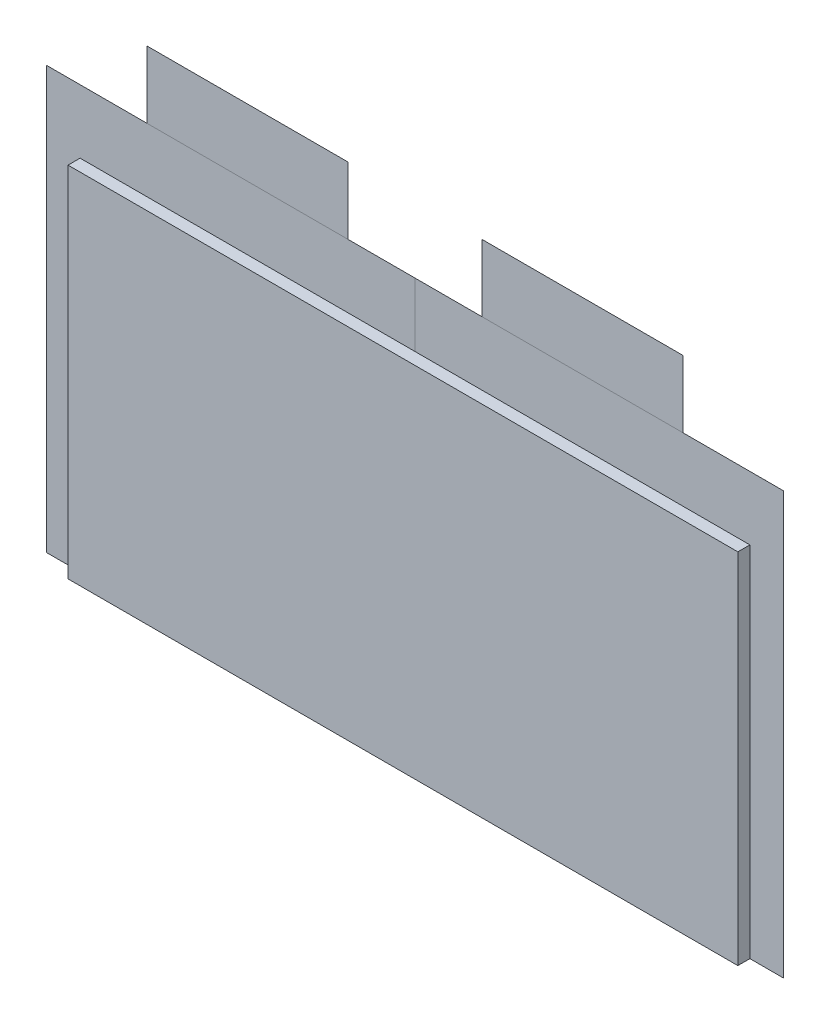
ISO-10303-21;
HEADER;
FILE_DESCRIPTION(('STEP AP214'),'2;1');
FILE_NAME('part.step','',(''),(''),'','','');
FILE_SCHEMA(('AUTOMOTIVE_DESIGN { 1 0 10303 214 1 1 1 1 }'));
ENDSEC;
DATA;
#1=APPLICATION_CONTEXT('core data for automotive mechanical design processes');
#2=APPLICATION_PROTOCOL_DEFINITION('international standard','automotive_design',2000,#1);
#3=PRODUCT_CONTEXT('',#1,'mechanical');
#4=PRODUCT('Part','Part','',(#3));
#5=PRODUCT_RELATED_PRODUCT_CATEGORY('part','',(#4));
#6=PRODUCT_DEFINITION_FORMATION('','',#4);
#7=PRODUCT_DEFINITION_CONTEXT('part definition',#1,'design');
#8=PRODUCT_DEFINITION('design','',#6,#7);
#9=PRODUCT_DEFINITION_SHAPE('','',#8);
#10=(LENGTH_UNIT() NAMED_UNIT(*) SI_UNIT(.MILLI.,.METRE.));
#11=(NAMED_UNIT(*) PLANE_ANGLE_UNIT() SI_UNIT($,.RADIAN.));
#12=(NAMED_UNIT(*) SI_UNIT($,.STERADIAN.) SOLID_ANGLE_UNIT());
#13=UNCERTAINTY_MEASURE_WITH_UNIT(LENGTH_MEASURE(1.E-05),#10,'distance_accuracy_value','');
#14=(GEOMETRIC_REPRESENTATION_CONTEXT(3) GLOBAL_UNCERTAINTY_ASSIGNED_CONTEXT((#13)) GLOBAL_UNIT_ASSIGNED_CONTEXT((#10,
#11,#12)) REPRESENTATION_CONTEXT('',''));
#15=CARTESIAN_POINT('',(0.,0.,0.));
#16=DIRECTION('',(0.,0.,1.));
#17=DIRECTION('',(1.,0.,0.));
#18=AXIS2_PLACEMENT_3D('',#15,#16,#17);
#19=CARTESIAN_POINT('',(0.,72.5,5.E-05));
#20=DIRECTION('',(0.,1.,0.));
#21=DIRECTION('',(-1.,0.,0.));
#22=AXIS2_PLACEMENT_3D('',#19,#20,#21);
#23=PLANE('',#22);
#24=DIRECTION('',(1.,0.,0.));
#25=VECTOR('',#24,1.);
#26=CARTESIAN_POINT('',(0.,72.5,-5.E-05));
#27=LINE('',#26,#25);
#28=CARTESIAN_POINT('',(20.,72.5,-5.E-05));
#29=VERTEX_POINT('',#28);
#30=CARTESIAN_POINT('',(80.,72.5,-5.E-05));
#31=VERTEX_POINT('',#30);
#32=EDGE_CURVE('E119',#29,#31,#27,.T.);
#33=ORIENTED_EDGE('',*,*,#32,.T.);
#34=DIRECTION('',(0.,0.,-1.));
#35=VECTOR('',#34,1.);
#36=CARTESIAN_POINT('',(80.,72.5,5.E-05));
#37=LINE('',#36,#35);
#38=CARTESIAN_POINT('',(80.,72.5,5.E-05));
#39=VERTEX_POINT('',#38);
#40=EDGE_CURVE('E12',#39,#31,#37,.T.);
#41=ORIENTED_EDGE('',*,*,#40,.F.);
#42=DIRECTION('',(1.,0.,0.));
#43=VECTOR('',#42,1.);
#44=CARTESIAN_POINT('',(0.,72.5,5.E-05));
#45=LINE('',#44,#43);
#46=CARTESIAN_POINT('',(20.,72.5,5.E-05));
#47=VERTEX_POINT('',#46);
#48=EDGE_CURVE('E107',#47,#39,#45,.T.);
#49=ORIENTED_EDGE('',*,*,#48,.F.);
#50=DIRECTION('',(0.,0.,-1.));
#51=VECTOR('',#50,1.);
#52=CARTESIAN_POINT('',(20.,72.5,5.E-05));
#53=LINE('',#52,#51);
#54=EDGE_CURVE('E115',#47,#29,#53,.T.);
#55=ORIENTED_EDGE('',*,*,#54,.T.);
#56=EDGE_LOOP('',(#33,#41,#49,#55));
#57=FACE_BOUND('',#56,.T.);
#58=ADVANCED_FACE('F56',(#57),#23,.F.);
#59=CARTESIAN_POINT('',(80.,0.,5.E-05));
#60=DIRECTION('',(-1.,0.,0.));
#61=DIRECTION('',(0.,0.,1.));
#62=AXIS2_PLACEMENT_3D('',#59,#60,#61);
#63=PLANE('',#62);
#64=DIRECTION('',(0.,1.,0.));
#65=VECTOR('',#64,1.);
#66=CARTESIAN_POINT('',(80.,0.,-5.E-05));
#67=LINE('',#66,#65);
#68=CARTESIAN_POINT('',(80.,92.5,-5.E-05));
#69=VERTEX_POINT('',#68);
#70=EDGE_CURVE('E111',#31,#69,#67,.T.);
#71=ORIENTED_EDGE('',*,*,#70,.T.);
#72=DIRECTION('',(0.,0.,-1.));
#73=VECTOR('',#72,1.);
#74=CARTESIAN_POINT('',(80.,92.5,5.E-05));
#75=LINE('',#74,#73);
#76=CARTESIAN_POINT('',(80.,92.5,5.E-05));
#77=VERTEX_POINT('',#76);
#78=EDGE_CURVE('E64',#77,#69,#75,.T.);
#79=ORIENTED_EDGE('',*,*,#78,.F.);
#80=DIRECTION('',(0.,1.,0.));
#81=VECTOR('',#80,1.);
#82=CARTESIAN_POINT('',(80.,0.,5.E-05));
#83=LINE('',#82,#81);
#84=EDGE_CURVE('E102',#39,#77,#83,.T.);
#85=ORIENTED_EDGE('',*,*,#84,.F.);
#86=ORIENTED_EDGE('',*,*,#40,.T.);
#87=EDGE_LOOP('',(#71,#79,#85,#86));
#88=FACE_BOUND('',#87,.T.);
#89=ADVANCED_FACE('F110',(#88),#63,.F.);
#90=CARTESIAN_POINT('',(0.,92.5,5.E-05));
#91=DIRECTION('',(0.,-1.,0.));
#92=DIRECTION('',(1.,0.,0.));
#93=AXIS2_PLACEMENT_3D('',#90,#91,#92);
#94=PLANE('',#93);
#95=DIRECTION('',(-1.,0.,0.));
#96=VECTOR('',#95,1.);
#97=CARTESIAN_POINT('',(0.,92.5,-5.E-05));
#98=LINE('',#97,#96);
#99=CARTESIAN_POINT('',(20.,92.5,-5.E-05));
#100=VERTEX_POINT('',#99);
#101=EDGE_CURVE('E89',#69,#100,#98,.T.);
#102=ORIENTED_EDGE('',*,*,#101,.T.);
#103=DIRECTION('',(0.,0.,-1.));
#104=VECTOR('',#103,1.);
#105=CARTESIAN_POINT('',(20.,92.5,5.E-05));
#106=LINE('',#105,#104);
#107=CARTESIAN_POINT('',(20.,92.5,5.E-05));
#108=VERTEX_POINT('',#107);
#109=EDGE_CURVE('E112',#108,#100,#106,.T.);
#110=ORIENTED_EDGE('',*,*,#109,.F.);
#111=DIRECTION('',(-1.,0.,0.));
#112=VECTOR('',#111,1.);
#113=CARTESIAN_POINT('',(0.,92.5,5.E-05));
#114=LINE('',#113,#112);
#115=EDGE_CURVE('E105',#77,#108,#114,.T.);
#116=ORIENTED_EDGE('',*,*,#115,.F.);
#117=ORIENTED_EDGE('',*,*,#78,.T.);
#118=EDGE_LOOP('',(#102,#110,#116,#117));
#119=FACE_BOUND('',#118,.T.);
#120=ADVANCED_FACE('F113',(#119),#94,.F.);
#121=CARTESIAN_POINT('',(20.0000000000001,0.,5.E-05));
#122=DIRECTION('',(1.,0.,0.));
#123=DIRECTION('',(0.,1.,0.));
#124=AXIS2_PLACEMENT_3D('',#121,#122,#123);
#125=PLANE('',#124);
#126=DIRECTION('',(0.,-1.,0.));
#127=VECTOR('',#126,1.);
#128=CARTESIAN_POINT('',(20.0000000000001,0.,-5.E-05));
#129=LINE('',#128,#127);
#130=EDGE_CURVE('E95',#100,#29,#129,.T.);
#131=ORIENTED_EDGE('',*,*,#130,.T.);
#132=ORIENTED_EDGE('',*,*,#54,.F.);
#133=DIRECTION('',(0.,-1.,0.));
#134=VECTOR('',#133,1.);
#135=CARTESIAN_POINT('',(20.0000000000001,0.,5.E-05));
#136=LINE('',#135,#134);
#137=EDGE_CURVE('E72',#108,#47,#136,.T.);
#138=ORIENTED_EDGE('',*,*,#137,.F.);
#139=ORIENTED_EDGE('',*,*,#109,.T.);
#140=EDGE_LOOP('',(#131,#132,#138,#139));
#141=FACE_BOUND('',#140,.T.);
#142=ADVANCED_FACE('F126',(#141),#125,.F.);
#143=CARTESIAN_POINT('',(0.,0.,5.E-05));
#144=DIRECTION('',(0.,0.,1.));
#145=DIRECTION('',(1.,0.,0.));
#146=AXIS2_PLACEMENT_3D('',#143,#144,#145);
#147=PLANE('',#146);
#148=ORIENTED_EDGE('',*,*,#48,.T.);
#149=ORIENTED_EDGE('',*,*,#84,.T.);
#150=ORIENTED_EDGE('',*,*,#115,.T.);
#151=ORIENTED_EDGE('',*,*,#137,.T.);
#152=EDGE_LOOP('',(#148,#149,#150,#151));
#153=FACE_BOUND('',#152,.T.);
#154=ADVANCED_FACE('F103',(#153),#147,.T.);
#155=CARTESIAN_POINT('',(0.,0.,-5.E-05));
#156=DIRECTION('',(0.,0.,1.));
#157=DIRECTION('',(1.,0.,0.));
#158=AXIS2_PLACEMENT_3D('',#155,#156,#157);
#159=PLANE('',#158);
#160=ORIENTED_EDGE('',*,*,#32,.F.);
#161=ORIENTED_EDGE('',*,*,#130,.F.);
#162=ORIENTED_EDGE('',*,*,#101,.F.);
#163=ORIENTED_EDGE('',*,*,#70,.F.);
#164=EDGE_LOOP('',(#160,#161,#162,#163));
#165=FACE_BOUND('',#164,.T.);
#166=ADVANCED_FACE('F129',(#165),#159,.F.);
#167=CLOSED_SHELL('',(#58,#89,#120,#142,#154,#166));
#168=MANIFOLD_SOLID_BREP('B2',#167);
#169=CARTESIAN_POINT('',(-20.,0.,5.E-05));
#170=DIRECTION('',(1.,0.,0.));
#171=DIRECTION('',(0.,1.,0.));
#172=AXIS2_PLACEMENT_3D('',#169,#170,#171);
#173=PLANE('',#172);
#174=DIRECTION('',(0.,-1.,0.));
#175=VECTOR('',#174,1.);
#176=CARTESIAN_POINT('',(-20.,0.,-5.E-05));
#177=LINE('',#176,#175);
#178=CARTESIAN_POINT('',(-20.,92.5,-5.E-05));
#179=VERTEX_POINT('',#178);
#180=CARTESIAN_POINT('',(-20.,72.5,-5.E-05));
#181=VERTEX_POINT('',#180);
#182=EDGE_CURVE('E253',#179,#181,#177,.T.);
#183=ORIENTED_EDGE('',*,*,#182,.F.);
#184=DIRECTION('',(0.,0.,-1.));
#185=VECTOR('',#184,1.);
#186=CARTESIAN_POINT('',(-20.,92.5,5.E-05));
#187=LINE('',#186,#185);
#188=CARTESIAN_POINT('',(-20.,92.5,5.E-05));
#189=VERTEX_POINT('',#188);
#190=EDGE_CURVE('E54',#189,#179,#187,.T.);
#191=ORIENTED_EDGE('',*,*,#190,.F.);
#192=DIRECTION('',(0.,-1.,0.));
#193=VECTOR('',#192,1.);
#194=CARTESIAN_POINT('',(-20.,0.,5.E-05));
#195=LINE('',#194,#193);
#196=CARTESIAN_POINT('',(-20.,72.5,5.E-05));
#197=VERTEX_POINT('',#196);
#198=EDGE_CURVE('E246',#189,#197,#195,.T.);
#199=ORIENTED_EDGE('',*,*,#198,.T.);
#200=DIRECTION('',(0.,0.,-1.));
#201=VECTOR('',#200,1.);
#202=CARTESIAN_POINT('',(-20.,72.5,5.E-05));
#203=LINE('',#202,#201);
#204=EDGE_CURVE('E228',#197,#181,#203,.T.);
#205=ORIENTED_EDGE('',*,*,#204,.T.);
#206=EDGE_LOOP('',(#183,#191,#199,#205));
#207=FACE_BOUND('',#206,.T.);
#208=ADVANCED_FACE('F190',(#207),#173,.T.);
#209=CARTESIAN_POINT('',(0.,92.5,5.E-05));
#210=DIRECTION('',(0.,1.,0.));
#211=DIRECTION('',(0.,0.,1.));
#212=AXIS2_PLACEMENT_3D('',#209,#210,#211);
#213=PLANE('',#212);
#214=DIRECTION('',(1.,0.,0.));
#215=VECTOR('',#214,1.);
#216=CARTESIAN_POINT('',(0.,92.5,-5.E-05));
#217=LINE('',#216,#215);
#218=CARTESIAN_POINT('',(-80.,92.5,-5.E-05));
#219=VERTEX_POINT('',#218);
#220=EDGE_CURVE('E239',#219,#179,#217,.T.);
#221=ORIENTED_EDGE('',*,*,#220,.F.);
#222=DIRECTION('',(0.,0.,-1.));
#223=VECTOR('',#222,1.);
#224=CARTESIAN_POINT('',(-80.,92.5,5.E-05));
#225=LINE('',#224,#223);
#226=CARTESIAN_POINT('',(-80.,92.5,5.E-05));
#227=VERTEX_POINT('',#226);
#228=EDGE_CURVE('E198',#227,#219,#225,.T.);
#229=ORIENTED_EDGE('',*,*,#228,.F.);
#230=DIRECTION('',(1.,0.,0.));
#231=VECTOR('',#230,1.);
#232=CARTESIAN_POINT('',(0.,92.5,5.E-05));
#233=LINE('',#232,#231);
#234=EDGE_CURVE('E237',#227,#189,#233,.T.);
#235=ORIENTED_EDGE('',*,*,#234,.T.);
#236=ORIENTED_EDGE('',*,*,#190,.T.);
#237=EDGE_LOOP('',(#221,#229,#235,#236));
#238=FACE_BOUND('',#237,.T.);
#239=ADVANCED_FACE('F236',(#238),#213,.T.);
#240=CARTESIAN_POINT('',(-80.,0.,5.E-05));
#241=DIRECTION('',(-1.,0.,0.));
#242=DIRECTION('',(0.,0.,1.));
#243=AXIS2_PLACEMENT_3D('',#240,#241,#242);
#244=PLANE('',#243);
#245=DIRECTION('',(0.,1.,0.));
#246=VECTOR('',#245,1.);
#247=CARTESIAN_POINT('',(-80.,0.,-5.E-05));
#248=LINE('',#247,#246);
#249=CARTESIAN_POINT('',(-80.,72.5,-5.E-05));
#250=VERTEX_POINT('',#249);
#251=EDGE_CURVE('E257',#250,#219,#248,.T.);
#252=ORIENTED_EDGE('',*,*,#251,.F.);
#253=DIRECTION('',(0.,0.,-1.));
#254=VECTOR('',#253,1.);
#255=CARTESIAN_POINT('',(-80.,72.5,5.E-05));
#256=LINE('',#255,#254);
#257=CARTESIAN_POINT('',(-80.,72.5,5.E-05));
#258=VERTEX_POINT('',#257);
#259=EDGE_CURVE('E221',#258,#250,#256,.T.);
#260=ORIENTED_EDGE('',*,*,#259,.F.);
#261=DIRECTION('',(0.,1.,0.));
#262=VECTOR('',#261,1.);
#263=CARTESIAN_POINT('',(-80.,0.,5.E-05));
#264=LINE('',#263,#262);
#265=EDGE_CURVE('E245',#258,#227,#264,.T.);
#266=ORIENTED_EDGE('',*,*,#265,.T.);
#267=ORIENTED_EDGE('',*,*,#228,.T.);
#268=EDGE_LOOP('',(#252,#260,#266,#267));
#269=FACE_BOUND('',#268,.T.);
#270=ADVANCED_FACE('F248',(#269),#244,.T.);
#271=CARTESIAN_POINT('',(0.,72.5,5.E-05));
#272=DIRECTION('',(0.,1.,0.));
#273=DIRECTION('',(-1.,0.,0.));
#274=AXIS2_PLACEMENT_3D('',#271,#272,#273);
#275=PLANE('',#274);
#276=DIRECTION('',(1.,0.,0.));
#277=VECTOR('',#276,1.);
#278=CARTESIAN_POINT('',(0.,72.5,-5.E-05));
#279=LINE('',#278,#277);
#280=EDGE_CURVE('E259',#250,#181,#279,.T.);
#281=ORIENTED_EDGE('',*,*,#280,.T.);
#282=ORIENTED_EDGE('',*,*,#204,.F.);
#283=DIRECTION('',(1.,0.,0.));
#284=VECTOR('',#283,1.);
#285=CARTESIAN_POINT('',(0.,72.5,5.E-05));
#286=LINE('',#285,#284);
#287=EDGE_CURVE('E206',#258,#197,#286,.T.);
#288=ORIENTED_EDGE('',*,*,#287,.F.);
#289=ORIENTED_EDGE('',*,*,#259,.T.);
#290=EDGE_LOOP('',(#281,#282,#288,#289));
#291=FACE_BOUND('',#290,.T.);
#292=ADVANCED_FACE('F269',(#291),#275,.F.);
#293=CARTESIAN_POINT('',(0.,0.,5.E-05));
#294=DIRECTION('',(0.,0.,1.));
#295=DIRECTION('',(1.,0.,0.));
#296=AXIS2_PLACEMENT_3D('',#293,#294,#295);
#297=PLANE('',#296);
#298=ORIENTED_EDGE('',*,*,#198,.F.);
#299=ORIENTED_EDGE('',*,*,#234,.F.);
#300=ORIENTED_EDGE('',*,*,#265,.F.);
#301=ORIENTED_EDGE('',*,*,#287,.T.);
#302=EDGE_LOOP('',(#298,#299,#300,#301));
#303=FACE_BOUND('',#302,.T.);
#304=ADVANCED_FACE('F244',(#303),#297,.T.);
#305=CARTESIAN_POINT('',(0.,0.,-5.E-05));
#306=DIRECTION('',(0.,0.,1.));
#307=DIRECTION('',(1.,0.,0.));
#308=AXIS2_PLACEMENT_3D('',#305,#306,#307);
#309=PLANE('',#308);
#310=ORIENTED_EDGE('',*,*,#182,.T.);
#311=ORIENTED_EDGE('',*,*,#280,.F.);
#312=ORIENTED_EDGE('',*,*,#251,.T.);
#313=ORIENTED_EDGE('',*,*,#220,.T.);
#314=EDGE_LOOP('',(#310,#311,#312,#313));
#315=FACE_BOUND('',#314,.T.);
#316=ADVANCED_FACE('F274',(#315),#309,.F.);
#317=CLOSED_SHELL('',(#208,#239,#270,#292,#304,#316));
#318=MANIFOLD_SOLID_BREP('B6',#317);
#319=CARTESIAN_POINT('',(0.,0.,5.E-05));
#320=DIRECTION('',(1.,0.,0.));
#321=DIRECTION('',(0.,0.,-1.));
#322=AXIS2_PLACEMENT_3D('',#319,#320,#321);
#323=PLANE('',#322);
#324=DIRECTION('',(0.,-1.,0.));
#325=VECTOR('',#324,1.);
#326=CARTESIAN_POINT('',(0.,0.,-5.E-05));
#327=LINE('',#326,#325);
#328=CARTESIAN_POINT('',(0.,72.5,-5.E-05));
#329=VERTEX_POINT('',#328);
#330=CARTESIAN_POINT('',(0.,53.5,-5.E-05));
#331=VERTEX_POINT('',#330);
#332=EDGE_CURVE('E404',#329,#331,#327,.T.);
#333=ORIENTED_EDGE('',*,*,#332,.F.);
#334=DIRECTION('',(0.,0.,-1.));
#335=VECTOR('',#334,1.);
#336=CARTESIAN_POINT('',(0.,72.5,5.E-05));
#337=LINE('',#336,#335);
#338=CARTESIAN_POINT('',(0.,72.5,5.E-05));
#339=VERTEX_POINT('',#338);
#340=EDGE_CURVE('E188',#339,#329,#337,.T.);
#341=ORIENTED_EDGE('',*,*,#340,.F.);
#342=DIRECTION('',(0.,-1.,0.));
#343=VECTOR('',#342,1.);
#344=CARTESIAN_POINT('',(0.,0.,5.E-05));
#345=LINE('',#344,#343);
#346=CARTESIAN_POINT('',(0.,53.5,5.E-05));
#347=VERTEX_POINT('',#346);
#348=EDGE_CURVE('E417',#339,#347,#345,.T.);
#349=ORIENTED_EDGE('',*,*,#348,.T.);
#350=DIRECTION('',(0.,0.,-1.));
#351=VECTOR('',#350,1.);
#352=CARTESIAN_POINT('',(0.,53.5,5.E-05));
#353=LINE('',#352,#351);
#354=EDGE_CURVE('E369',#347,#331,#353,.T.);
#355=ORIENTED_EDGE('',*,*,#354,.T.);
#356=EDGE_LOOP('',(#333,#341,#349,#355));
#357=FACE_BOUND('',#356,.T.);
#358=ADVANCED_FACE('F324',(#357),#323,.T.);
#359=CARTESIAN_POINT('',(0.,72.5,5.E-05));
#360=DIRECTION('',(0.,1.,0.));
#361=DIRECTION('',(-1.,0.,0.));
#362=AXIS2_PLACEMENT_3D('',#359,#360,#361);
#363=PLANE('',#362);
#364=DIRECTION('',(1.,0.,0.));
#365=VECTOR('',#364,1.);
#366=CARTESIAN_POINT('',(0.,72.5,-5.E-05));
#367=LINE('',#366,#365);
#368=CARTESIAN_POINT('',(-110.,72.5,-5.E-05));
#369=VERTEX_POINT('',#368);
#370=EDGE_CURVE('E407',#369,#329,#367,.T.);
#371=ORIENTED_EDGE('',*,*,#370,.F.);
#372=DIRECTION('',(0.,0.,-1.));
#373=VECTOR('',#372,1.);
#374=CARTESIAN_POINT('',(-110.,72.5,5.E-05));
#375=LINE('',#374,#373);
#376=CARTESIAN_POINT('',(-110.,72.5,5.E-05));
#377=VERTEX_POINT('',#376);
#378=EDGE_CURVE('E332',#377,#369,#375,.T.);
#379=ORIENTED_EDGE('',*,*,#378,.F.);
#380=DIRECTION('',(1.,0.,0.));
#381=VECTOR('',#380,1.);
#382=CARTESIAN_POINT('',(0.,72.5,5.E-05));
#383=LINE('',#382,#381);
#384=EDGE_CURVE('E432',#377,#339,#383,.T.);
#385=ORIENTED_EDGE('',*,*,#384,.T.);
#386=ORIENTED_EDGE('',*,*,#340,.T.);
#387=EDGE_LOOP('',(#371,#379,#385,#386));
#388=FACE_BOUND('',#387,.T.);
#389=ADVANCED_FACE('F426',(#388),#363,.T.);
#390=CARTESIAN_POINT('',(-110.,0.,5.E-05));
#391=DIRECTION('',(-1.,0.,0.));
#392=DIRECTION('',(0.,0.,1.));
#393=AXIS2_PLACEMENT_3D('',#390,#391,#392);
#394=PLANE('',#393);
#395=DIRECTION('',(0.,1.,0.));
#396=VECTOR('',#395,1.);
#397=CARTESIAN_POINT('',(-110.,0.,-5.E-05));
#398=LINE('',#397,#396);
#399=CARTESIAN_POINT('',(-110.,-53.5,-5.E-05));
#400=VERTEX_POINT('',#399);
#401=EDGE_CURVE('E410',#400,#369,#398,.T.);
#402=ORIENTED_EDGE('',*,*,#401,.F.);
#403=DIRECTION('',(0.,0.,-1.));
#404=VECTOR('',#403,1.);
#405=CARTESIAN_POINT('',(-110.,-53.5,5.E-05));
#406=LINE('',#405,#404);
#407=CARTESIAN_POINT('',(-110.,-53.5,5.E-05));
#408=VERTEX_POINT('',#407);
#409=EDGE_CURVE('E396',#408,#400,#406,.T.);
#410=ORIENTED_EDGE('',*,*,#409,.F.);
#411=DIRECTION('',(0.,1.,0.));
#412=VECTOR('',#411,1.);
#413=CARTESIAN_POINT('',(-110.,0.,5.E-05));
#414=LINE('',#413,#412);
#415=EDGE_CURVE('E389',#408,#377,#414,.T.);
#416=ORIENTED_EDGE('',*,*,#415,.T.);
#417=ORIENTED_EDGE('',*,*,#378,.T.);
#418=EDGE_LOOP('',(#402,#410,#416,#417));
#419=FACE_BOUND('',#418,.T.);
#420=ADVANCED_FACE('F423',(#419),#394,.T.);
#421=CARTESIAN_POINT('',(0.,-53.5,5.E-05));
#422=DIRECTION('',(0.,1.,0.));
#423=DIRECTION('',(-1.,0.,0.));
#424=AXIS2_PLACEMENT_3D('',#421,#422,#423);
#425=PLANE('',#424);
#426=DIRECTION('',(1.,0.,0.));
#427=VECTOR('',#426,1.);
#428=CARTESIAN_POINT('',(0.,-53.5,-5.E-05));
#429=LINE('',#428,#427);
#430=CARTESIAN_POINT('',(-100.,-53.5,-5.E-05));
#431=VERTEX_POINT('',#430);
#432=EDGE_CURVE('E395',#400,#431,#429,.T.);
#433=ORIENTED_EDGE('',*,*,#432,.T.);
#434=DIRECTION('',(0.,0.,-1.));
#435=VECTOR('',#434,1.);
#436=CARTESIAN_POINT('',(-100.,-53.5,5.E-05));
#437=LINE('',#436,#435);
#438=CARTESIAN_POINT('',(-100.,-53.5,5.E-05));
#439=VERTEX_POINT('',#438);
#440=EDGE_CURVE('E392',#439,#431,#437,.T.);
#441=ORIENTED_EDGE('',*,*,#440,.F.);
#442=DIRECTION('',(1.,0.,0.));
#443=VECTOR('',#442,1.);
#444=CARTESIAN_POINT('',(0.,-53.5,5.E-05));
#445=LINE('',#444,#443);
#446=EDGE_CURVE('E382',#408,#439,#445,.T.);
#447=ORIENTED_EDGE('',*,*,#446,.F.);
#448=ORIENTED_EDGE('',*,*,#409,.T.);
#449=EDGE_LOOP('',(#433,#441,#447,#448));
#450=FACE_BOUND('',#449,.T.);
#451=ADVANCED_FACE('F393',(#450),#425,.F.);
#452=CARTESIAN_POINT('',(-100.,0.,5.E-05));
#453=DIRECTION('',(-1.,0.,0.));
#454=DIRECTION('',(0.,0.,1.));
#455=AXIS2_PLACEMENT_3D('',#452,#453,#454);
#456=PLANE('',#455);
#457=DIRECTION('',(0.,1.,0.));
#458=VECTOR('',#457,1.);
#459=CARTESIAN_POINT('',(-100.,0.,-5.E-05));
#460=LINE('',#459,#458);
#461=CARTESIAN_POINT('',(-100.,53.5,-5.E-05));
#462=VERTEX_POINT('',#461);
#463=EDGE_CURVE('E362',#431,#462,#460,.T.);
#464=ORIENTED_EDGE('',*,*,#463,.T.);
#465=DIRECTION('',(0.,0.,-1.));
#466=VECTOR('',#465,1.);
#467=CARTESIAN_POINT('',(-100.,53.5,5.E-05));
#468=LINE('',#467,#466);
#469=CARTESIAN_POINT('',(-100.,53.5,5.E-05));
#470=VERTEX_POINT('',#469);
#471=EDGE_CURVE('E397',#470,#462,#468,.T.);
#472=ORIENTED_EDGE('',*,*,#471,.F.);
#473=DIRECTION('',(0.,1.,0.));
#474=VECTOR('',#473,1.);
#475=CARTESIAN_POINT('',(-100.,0.,5.E-05));
#476=LINE('',#475,#474);
#477=EDGE_CURVE('E386',#439,#470,#476,.T.);
#478=ORIENTED_EDGE('',*,*,#477,.F.);
#479=ORIENTED_EDGE('',*,*,#440,.T.);
#480=EDGE_LOOP('',(#464,#472,#478,#479));
#481=FACE_BOUND('',#480,.T.);
#482=ADVANCED_FACE('F399',(#481),#456,.F.);
#483=CARTESIAN_POINT('',(0.,53.5,5.E-05));
#484=DIRECTION('',(0.,1.,0.));
#485=DIRECTION('',(-1.,0.,0.));
#486=AXIS2_PLACEMENT_3D('',#483,#484,#485);
#487=PLANE('',#486);
#488=DIRECTION('',(1.,0.,0.));
#489=VECTOR('',#488,1.);
#490=CARTESIAN_POINT('',(0.,53.5,-5.E-05));
#491=LINE('',#490,#489);
#492=EDGE_CURVE('E415',#462,#331,#491,.T.);
#493=ORIENTED_EDGE('',*,*,#492,.T.);
#494=ORIENTED_EDGE('',*,*,#354,.F.);
#495=DIRECTION('',(1.,0.,0.));
#496=VECTOR('',#495,1.);
#497=CARTESIAN_POINT('',(0.,53.5,5.E-05));
#498=LINE('',#497,#496);
#499=EDGE_CURVE('E340',#470,#347,#498,.T.);
#500=ORIENTED_EDGE('',*,*,#499,.F.);
#501=ORIENTED_EDGE('',*,*,#471,.T.);
#502=EDGE_LOOP('',(#493,#494,#500,#501));
#503=FACE_BOUND('',#502,.T.);
#504=ADVANCED_FACE('F431',(#503),#487,.F.);
#505=CARTESIAN_POINT('',(0.,0.,5.E-05));
#506=DIRECTION('',(0.,0.,1.));
#507=DIRECTION('',(1.,0.,0.));
#508=AXIS2_PLACEMENT_3D('',#505,#506,#507);
#509=PLANE('',#508);
#510=ORIENTED_EDGE('',*,*,#348,.F.);
#511=ORIENTED_EDGE('',*,*,#384,.F.);
#512=ORIENTED_EDGE('',*,*,#415,.F.);
#513=ORIENTED_EDGE('',*,*,#446,.T.);
#514=ORIENTED_EDGE('',*,*,#477,.T.);
#515=ORIENTED_EDGE('',*,*,#499,.T.);
#516=EDGE_LOOP('',(#510,#511,#512,#513,#514,#515));
#517=FACE_BOUND('',#516,.T.);
#518=ADVANCED_FACE('F384',(#517),#509,.T.);
#519=CARTESIAN_POINT('',(0.,0.,-5.E-05));
#520=DIRECTION('',(0.,0.,1.));
#521=DIRECTION('',(1.,0.,0.));
#522=AXIS2_PLACEMENT_3D('',#519,#520,#521);
#523=PLANE('',#522);
#524=ORIENTED_EDGE('',*,*,#332,.T.);
#525=ORIENTED_EDGE('',*,*,#492,.F.);
#526=ORIENTED_EDGE('',*,*,#463,.F.);
#527=ORIENTED_EDGE('',*,*,#432,.F.);
#528=ORIENTED_EDGE('',*,*,#401,.T.);
#529=ORIENTED_EDGE('',*,*,#370,.T.);
#530=EDGE_LOOP('',(#524,#525,#526,#527,#528,#529));
#531=FACE_BOUND('',#530,.T.);
#532=ADVANCED_FACE('F428',(#531),#523,.F.);
#533=CLOSED_SHELL('',(#358,#389,#420,#451,#482,#504,#518,#532));
#534=MANIFOLD_SOLID_BREP('B48',#533);
#535=CARTESIAN_POINT('',(0.,72.5,5.E-05));
#536=DIRECTION('',(0.,1.,0.));
#537=DIRECTION('',(-1.,0.,0.));
#538=AXIS2_PLACEMENT_3D('',#535,#536,#537);
#539=PLANE('',#538);
#540=DIRECTION('',(1.,0.,0.));
#541=VECTOR('',#540,1.);
#542=CARTESIAN_POINT('',(0.,72.5,-5.E-05));
#543=LINE('',#542,#541);
#544=CARTESIAN_POINT('',(0.,72.5,-5.E-05));
#545=VERTEX_POINT('',#544);
#546=CARTESIAN_POINT('',(110.,72.5,-5.E-05));
#547=VERTEX_POINT('',#546);
#548=EDGE_CURVE('E590',#545,#547,#543,.T.);
#549=ORIENTED_EDGE('',*,*,#548,.F.);
#550=DIRECTION('',(0.,0.,-1.));
#551=VECTOR('',#550,1.);
#552=CARTESIAN_POINT('',(0.,72.5,5.E-05));
#553=LINE('',#552,#551);
#554=CARTESIAN_POINT('',(0.,72.5,5.E-05));
#555=VERTEX_POINT('',#554);
#556=EDGE_CURVE('E322',#555,#545,#553,.T.);
#557=ORIENTED_EDGE('',*,*,#556,.F.);
#558=DIRECTION('',(1.,0.,0.));
#559=VECTOR('',#558,1.);
#560=CARTESIAN_POINT('',(0.,72.5,5.E-05));
#561=LINE('',#560,#559);
#562=CARTESIAN_POINT('',(110.,72.5,5.E-05));
#563=VERTEX_POINT('',#562);
#564=EDGE_CURVE('E601',#555,#563,#561,.T.);
#565=ORIENTED_EDGE('',*,*,#564,.T.);
#566=DIRECTION('',(0.,0.,-1.));
#567=VECTOR('',#566,1.);
#568=CARTESIAN_POINT('',(110.,72.5,5.E-05));
#569=LINE('',#568,#567);
#570=EDGE_CURVE('E554',#563,#547,#569,.T.);
#571=ORIENTED_EDGE('',*,*,#570,.T.);
#572=EDGE_LOOP('',(#549,#557,#565,#571));
#573=FACE_BOUND('',#572,.T.);
#574=ADVANCED_FACE('F509',(#573),#539,.T.);
#575=CARTESIAN_POINT('',(0.,0.,5.E-05));
#576=DIRECTION('',(1.,0.,0.));
#577=DIRECTION('',(0.,0.,-1.));
#578=AXIS2_PLACEMENT_3D('',#575,#576,#577);
#579=PLANE('',#578);
#580=DIRECTION('',(0.,-1.,0.));
#581=VECTOR('',#580,1.);
#582=CARTESIAN_POINT('',(0.,0.,-5.E-05));
#583=LINE('',#582,#581);
#584=CARTESIAN_POINT('',(0.,53.5,-5.E-05));
#585=VERTEX_POINT('',#584);
#586=EDGE_CURVE('E593',#545,#585,#583,.T.);
#587=ORIENTED_EDGE('',*,*,#586,.T.);
#588=DIRECTION('',(0.,0.,-1.));
#589=VECTOR('',#588,1.);
#590=CARTESIAN_POINT('',(0.,53.5,5.E-05));
#591=LINE('',#590,#589);
#592=CARTESIAN_POINT('',(0.,53.5,5.E-05));
#593=VERTEX_POINT('',#592);
#594=EDGE_CURVE('E517',#593,#585,#591,.T.);
#595=ORIENTED_EDGE('',*,*,#594,.F.);
#596=DIRECTION('',(0.,-1.,0.));
#597=VECTOR('',#596,1.);
#598=CARTESIAN_POINT('',(0.,0.,5.E-05));
#599=LINE('',#598,#597);
#600=EDGE_CURVE('E616',#555,#593,#599,.T.);
#601=ORIENTED_EDGE('',*,*,#600,.F.);
#602=ORIENTED_EDGE('',*,*,#556,.T.);
#603=EDGE_LOOP('',(#587,#595,#601,#602));
#604=FACE_BOUND('',#603,.T.);
#605=ADVANCED_FACE('F619',(#604),#579,.F.);
#606=CARTESIAN_POINT('',(0.,53.5,5.E-05));
#607=DIRECTION('',(0.,1.,0.));
#608=DIRECTION('',(-1.,0.,0.));
#609=AXIS2_PLACEMENT_3D('',#606,#607,#608);
#610=PLANE('',#609);
#611=DIRECTION('',(1.,0.,0.));
#612=VECTOR('',#611,1.);
#613=CARTESIAN_POINT('',(0.,53.5,-5.E-05));
#614=LINE('',#613,#612);
#615=CARTESIAN_POINT('',(100.,53.5,-5.E-05));
#616=VERTEX_POINT('',#615);
#617=EDGE_CURVE('E595',#585,#616,#614,.T.);
#618=ORIENTED_EDGE('',*,*,#617,.T.);
#619=DIRECTION('',(0.,0.,-1.));
#620=VECTOR('',#619,1.);
#621=CARTESIAN_POINT('',(100.,53.5,5.E-05));
#622=LINE('',#621,#620);
#623=CARTESIAN_POINT('',(100.,53.5,5.E-05));
#624=VERTEX_POINT('',#623);
#625=EDGE_CURVE('E582',#624,#616,#622,.T.);
#626=ORIENTED_EDGE('',*,*,#625,.F.);
#627=DIRECTION('',(1.,0.,0.));
#628=VECTOR('',#627,1.);
#629=CARTESIAN_POINT('',(0.,53.5,5.E-05));
#630=LINE('',#629,#628);
#631=EDGE_CURVE('E573',#593,#624,#630,.T.);
#632=ORIENTED_EDGE('',*,*,#631,.F.);
#633=ORIENTED_EDGE('',*,*,#594,.T.);
#634=EDGE_LOOP('',(#618,#626,#632,#633));
#635=FACE_BOUND('',#634,.T.);
#636=ADVANCED_FACE('F608',(#635),#610,.F.);
#637=CARTESIAN_POINT('',(100.,0.,5.E-05));
#638=DIRECTION('',(1.,0.,0.));
#639=DIRECTION('',(0.,0.,-1.));
#640=AXIS2_PLACEMENT_3D('',#637,#638,#639);
#641=PLANE('',#640);
#642=DIRECTION('',(0.,-1.,0.));
#643=VECTOR('',#642,1.);
#644=CARTESIAN_POINT('',(100.,0.,-5.E-05));
#645=LINE('',#644,#643);
#646=CARTESIAN_POINT('',(100.,-53.5,-5.E-05));
#647=VERTEX_POINT('',#646);
#648=EDGE_CURVE('E581',#616,#647,#645,.T.);
#649=ORIENTED_EDGE('',*,*,#648,.T.);
#650=DIRECTION('',(0.,0.,-1.));
#651=VECTOR('',#650,1.);
#652=CARTESIAN_POINT('',(100.,-53.5,5.E-05));
#653=LINE('',#652,#651);
#654=CARTESIAN_POINT('',(100.,-53.5,5.E-05));
#655=VERTEX_POINT('',#654);
#656=EDGE_CURVE('E578',#655,#647,#653,.T.);
#657=ORIENTED_EDGE('',*,*,#656,.F.);
#658=DIRECTION('',(0.,-1.,0.));
#659=VECTOR('',#658,1.);
#660=CARTESIAN_POINT('',(100.,0.,5.E-05));
#661=LINE('',#660,#659);
#662=EDGE_CURVE('E567',#624,#655,#661,.T.);
#663=ORIENTED_EDGE('',*,*,#662,.F.);
#664=ORIENTED_EDGE('',*,*,#625,.T.);
#665=EDGE_LOOP('',(#649,#657,#663,#664));
#666=FACE_BOUND('',#665,.T.);
#667=ADVANCED_FACE('F579',(#666),#641,.F.);
#668=CARTESIAN_POINT('',(0.,-53.5,5.E-05));
#669=DIRECTION('',(0.,1.,0.));
#670=DIRECTION('',(-1.,0.,0.));
#671=AXIS2_PLACEMENT_3D('',#668,#669,#670);
#672=PLANE('',#671);
#673=DIRECTION('',(1.,0.,0.));
#674=VECTOR('',#673,1.);
#675=CARTESIAN_POINT('',(0.,-53.5,-5.E-05));
#676=LINE('',#675,#674);
#677=CARTESIAN_POINT('',(110.,-53.5,-5.E-05));
#678=VERTEX_POINT('',#677);
#679=EDGE_CURVE('E547',#647,#678,#676,.T.);
#680=ORIENTED_EDGE('',*,*,#679,.T.);
#681=DIRECTION('',(0.,0.,-1.));
#682=VECTOR('',#681,1.);
#683=CARTESIAN_POINT('',(110.,-53.5,5.E-05));
#684=LINE('',#683,#682);
#685=CARTESIAN_POINT('',(110.,-53.5,5.E-05));
#686=VERTEX_POINT('',#685);
#687=EDGE_CURVE('E583',#686,#678,#684,.T.);
#688=ORIENTED_EDGE('',*,*,#687,.F.);
#689=DIRECTION('',(1.,0.,0.));
#690=VECTOR('',#689,1.);
#691=CARTESIAN_POINT('',(0.,-53.5,5.E-05));
#692=LINE('',#691,#690);
#693=EDGE_CURVE('E571',#655,#686,#692,.T.);
#694=ORIENTED_EDGE('',*,*,#693,.F.);
#695=ORIENTED_EDGE('',*,*,#656,.T.);
#696=EDGE_LOOP('',(#680,#688,#694,#695));
#697=FACE_BOUND('',#696,.T.);
#698=ADVANCED_FACE('F585',(#697),#672,.F.);
#699=CARTESIAN_POINT('',(110.,0.,5.E-05));
#700=DIRECTION('',(-1.,0.,0.));
#701=DIRECTION('',(0.,0.,1.));
#702=AXIS2_PLACEMENT_3D('',#699,#700,#701);
#703=PLANE('',#702);
#704=DIRECTION('',(0.,1.,0.));
#705=VECTOR('',#704,1.);
#706=CARTESIAN_POINT('',(110.,0.,-5.E-05));
#707=LINE('',#706,#705);
#708=EDGE_CURVE('E599',#678,#547,#707,.T.);
#709=ORIENTED_EDGE('',*,*,#708,.T.);
#710=ORIENTED_EDGE('',*,*,#570,.F.);
#711=DIRECTION('',(0.,1.,0.));
#712=VECTOR('',#711,1.);
#713=CARTESIAN_POINT('',(110.,0.,5.E-05));
#714=LINE('',#713,#712);
#715=EDGE_CURVE('E525',#686,#563,#714,.T.);
#716=ORIENTED_EDGE('',*,*,#715,.F.);
#717=ORIENTED_EDGE('',*,*,#687,.T.);
#718=EDGE_LOOP('',(#709,#710,#716,#717));
#719=FACE_BOUND('',#718,.T.);
#720=ADVANCED_FACE('F615',(#719),#703,.F.);
#721=CARTESIAN_POINT('',(0.,0.,5.E-05));
#722=DIRECTION('',(0.,0.,1.));
#723=DIRECTION('',(1.,0.,0.));
#724=AXIS2_PLACEMENT_3D('',#721,#722,#723);
#725=PLANE('',#724);
#726=ORIENTED_EDGE('',*,*,#564,.F.);
#727=ORIENTED_EDGE('',*,*,#600,.T.);
#728=ORIENTED_EDGE('',*,*,#631,.T.);
#729=ORIENTED_EDGE('',*,*,#662,.T.);
#730=ORIENTED_EDGE('',*,*,#693,.T.);
#731=ORIENTED_EDGE('',*,*,#715,.T.);
#732=EDGE_LOOP('',(#726,#727,#728,#729,#730,#731));
#733=FACE_BOUND('',#732,.T.);
#734=ADVANCED_FACE('F569',(#733),#725,.T.);
#735=CARTESIAN_POINT('',(0.,0.,-5.E-05));
#736=DIRECTION('',(0.,0.,1.));
#737=DIRECTION('',(1.,0.,0.));
#738=AXIS2_PLACEMENT_3D('',#735,#736,#737);
#739=PLANE('',#738);
#740=ORIENTED_EDGE('',*,*,#548,.T.);
#741=ORIENTED_EDGE('',*,*,#708,.F.);
#742=ORIENTED_EDGE('',*,*,#679,.F.);
#743=ORIENTED_EDGE('',*,*,#648,.F.);
#744=ORIENTED_EDGE('',*,*,#617,.F.);
#745=ORIENTED_EDGE('',*,*,#586,.F.);
#746=EDGE_LOOP('',(#740,#741,#742,#743,#744,#745));
#747=FACE_BOUND('',#746,.T.);
#748=ADVANCED_FACE('F612',(#747),#739,.F.);
#749=CLOSED_SHELL('',(#574,#605,#636,#667,#698,#720,#734,#748));
#750=MANIFOLD_SOLID_BREP('B182',#749);
#751=CARTESIAN_POINT('',(100.,0.,3.6));
#752=DIRECTION('',(1.,0.,0.));
#753=DIRECTION('',(0.,0.,-1.));
#754=AXIS2_PLACEMENT_3D('',#751,#752,#753);
#755=PLANE('',#754);
#756=DIRECTION('',(0.,-1.,0.));
#757=VECTOR('',#756,1.);
#758=CARTESIAN_POINT('',(100.,0.,-3.6));
#759=LINE('',#758,#757);
#760=CARTESIAN_POINT('',(100.,53.5,-3.6));
#761=VERTEX_POINT('',#760);
#762=CARTESIAN_POINT('',(100.,-53.5,-3.6));
#763=VERTEX_POINT('',#762);
#764=EDGE_CURVE('E753',#761,#763,#759,.T.);
#765=ORIENTED_EDGE('',*,*,#764,.F.);
#766=DIRECTION('',(0.,0.,-1.));
#767=VECTOR('',#766,1.);
#768=CARTESIAN_POINT('',(100.,53.5,3.6));
#769=LINE('',#768,#767);
#770=CARTESIAN_POINT('',(100.,53.5,3.6));
#771=VERTEX_POINT('',#770);
#772=EDGE_CURVE('E507',#771,#761,#769,.T.);
#773=ORIENTED_EDGE('',*,*,#772,.F.);
#774=DIRECTION('',(0.,-1.,0.));
#775=VECTOR('',#774,1.);
#776=CARTESIAN_POINT('',(100.,0.,3.6));
#777=LINE('',#776,#775);
#778=CARTESIAN_POINT('',(100.,-53.5,3.6));
#779=VERTEX_POINT('',#778);
#780=EDGE_CURVE('E743',#771,#779,#777,.T.);
#781=ORIENTED_EDGE('',*,*,#780,.T.);
#782=DIRECTION('',(0.,0.,-1.));
#783=VECTOR('',#782,1.);
#784=CARTESIAN_POINT('',(100.,-53.5,3.6));
#785=LINE('',#784,#783);
#786=EDGE_CURVE('E724',#779,#763,#785,.T.);
#787=ORIENTED_EDGE('',*,*,#786,.T.);
#788=EDGE_LOOP('',(#765,#773,#781,#787));
#789=FACE_BOUND('',#788,.T.);
#790=ADVANCED_FACE('F685',(#789),#755,.T.);
#791=CARTESIAN_POINT('',(0.,53.5,3.6));
#792=DIRECTION('',(0.,1.,0.));
#793=DIRECTION('',(-1.,0.,0.));
#794=AXIS2_PLACEMENT_3D('',#791,#792,#793);
#795=PLANE('',#794);
#796=DIRECTION('',(1.,0.,0.));
#797=VECTOR('',#796,1.);
#798=CARTESIAN_POINT('',(0.,53.5,-3.6));
#799=LINE('',#798,#797);
#800=CARTESIAN_POINT('',(-100.,53.5,-3.6));
#801=VERTEX_POINT('',#800);
#802=EDGE_CURVE('E735',#801,#761,#799,.T.);
#803=ORIENTED_EDGE('',*,*,#802,.F.);
#804=DIRECTION('',(0.,0.,-1.));
#805=VECTOR('',#804,1.);
#806=CARTESIAN_POINT('',(-100.,53.5,3.6));
#807=LINE('',#806,#805);
#808=CARTESIAN_POINT('',(-100.,53.5,3.6));
#809=VERTEX_POINT('',#808);
#810=EDGE_CURVE('E694',#809,#801,#807,.T.);
#811=ORIENTED_EDGE('',*,*,#810,.F.);
#812=DIRECTION('',(1.,0.,0.));
#813=VECTOR('',#812,1.);
#814=CARTESIAN_POINT('',(0.,53.5,3.6));
#815=LINE('',#814,#813);
#816=EDGE_CURVE('E733',#809,#771,#815,.T.);
#817=ORIENTED_EDGE('',*,*,#816,.T.);
#818=ORIENTED_EDGE('',*,*,#772,.T.);
#819=EDGE_LOOP('',(#803,#811,#817,#818));
#820=FACE_BOUND('',#819,.T.);
#821=ADVANCED_FACE('F732',(#820),#795,.T.);
#822=CARTESIAN_POINT('',(-100.,0.,3.6));
#823=DIRECTION('',(-1.,0.,0.));
#824=DIRECTION('',(0.,0.,1.));
#825=AXIS2_PLACEMENT_3D('',#822,#823,#824);
#826=PLANE('',#825);
#827=DIRECTION('',(0.,1.,0.));
#828=VECTOR('',#827,1.);
#829=CARTESIAN_POINT('',(-100.,0.,-3.6));
#830=LINE('',#829,#828);
#831=CARTESIAN_POINT('',(-100.,-53.5,-3.6));
#832=VERTEX_POINT('',#831);
#833=EDGE_CURVE('E759',#832,#801,#830,.T.);
#834=ORIENTED_EDGE('',*,*,#833,.F.);
#835=DIRECTION('',(0.,0.,-1.));
#836=VECTOR('',#835,1.);
#837=CARTESIAN_POINT('',(-100.,-53.5,3.6));
#838=LINE('',#837,#836);
#839=CARTESIAN_POINT('',(-100.,-53.5,3.6));
#840=VERTEX_POINT('',#839);
#841=EDGE_CURVE('E717',#840,#832,#838,.T.);
#842=ORIENTED_EDGE('',*,*,#841,.F.);
#843=DIRECTION('',(0.,1.,0.));
#844=VECTOR('',#843,1.);
#845=CARTESIAN_POINT('',(-100.,0.,3.6));
#846=LINE('',#845,#844);
#847=EDGE_CURVE('E742',#840,#809,#846,.T.);
#848=ORIENTED_EDGE('',*,*,#847,.T.);
#849=ORIENTED_EDGE('',*,*,#810,.T.);
#850=EDGE_LOOP('',(#834,#842,#848,#849));
#851=FACE_BOUND('',#850,.T.);
#852=ADVANCED_FACE('F746',(#851),#826,.T.);
#853=CARTESIAN_POINT('',(0.,-53.5,3.6));
#854=DIRECTION('',(0.,1.,0.));
#855=DIRECTION('',(-1.,0.,0.));
#856=AXIS2_PLACEMENT_3D('',#853,#854,#855);
#857=PLANE('',#856);
#858=DIRECTION('',(1.,0.,0.));
#859=VECTOR('',#858,1.);
#860=CARTESIAN_POINT('',(0.,-53.5,-3.6));
#861=LINE('',#860,#859);
#862=EDGE_CURVE('E762',#832,#763,#861,.T.);
#863=ORIENTED_EDGE('',*,*,#862,.T.);
#864=ORIENTED_EDGE('',*,*,#786,.F.);
#865=DIRECTION('',(1.,0.,0.));
#866=VECTOR('',#865,1.);
#867=CARTESIAN_POINT('',(0.,-53.5,3.6));
#868=LINE('',#867,#866);
#869=EDGE_CURVE('E702',#840,#779,#868,.T.);
#870=ORIENTED_EDGE('',*,*,#869,.F.);
#871=ORIENTED_EDGE('',*,*,#841,.T.);
#872=EDGE_LOOP('',(#863,#864,#870,#871));
#873=FACE_BOUND('',#872,.T.);
#874=ADVANCED_FACE('F776',(#873),#857,.F.);
#875=CARTESIAN_POINT('',(0.,0.,3.6));
#876=DIRECTION('',(0.,0.,1.));
#877=DIRECTION('',(1.,0.,0.));
#878=AXIS2_PLACEMENT_3D('',#875,#876,#877);
#879=PLANE('',#878);
#880=ORIENTED_EDGE('',*,*,#780,.F.);
#881=ORIENTED_EDGE('',*,*,#816,.F.);
#882=ORIENTED_EDGE('',*,*,#847,.F.);
#883=ORIENTED_EDGE('',*,*,#869,.T.);
#884=EDGE_LOOP('',(#880,#881,#882,#883));
#885=FACE_BOUND('',#884,.T.);
#886=ADVANCED_FACE('F741',(#885),#879,.T.);
#887=CARTESIAN_POINT('',(0.,0.,-3.6));
#888=DIRECTION('',(0.,0.,1.));
#889=DIRECTION('',(1.,0.,0.));
#890=AXIS2_PLACEMENT_3D('',#887,#888,#889);
#891=PLANE('',#890);
#892=ORIENTED_EDGE('',*,*,#764,.T.);
#893=ORIENTED_EDGE('',*,*,#862,.F.);
#894=ORIENTED_EDGE('',*,*,#833,.T.);
#895=ORIENTED_EDGE('',*,*,#802,.T.);
#896=EDGE_LOOP('',(#892,#893,#894,#895));
#897=FACE_BOUND('',#896,.T.);
#898=ADVANCED_FACE('F781',(#897),#891,.F.);
#899=CLOSED_SHELL('',(#790,#821,#852,#874,#886,#898));
#900=MANIFOLD_SOLID_BREP('B316',#899);
#901=ADVANCED_BREP_SHAPE_REPRESENTATION('',(#18,#168,#318,#534,#750,#900),#14);
#902=SHAPE_DEFINITION_REPRESENTATION(#9,#901);
ENDSEC;
END-ISO-10303-21;
